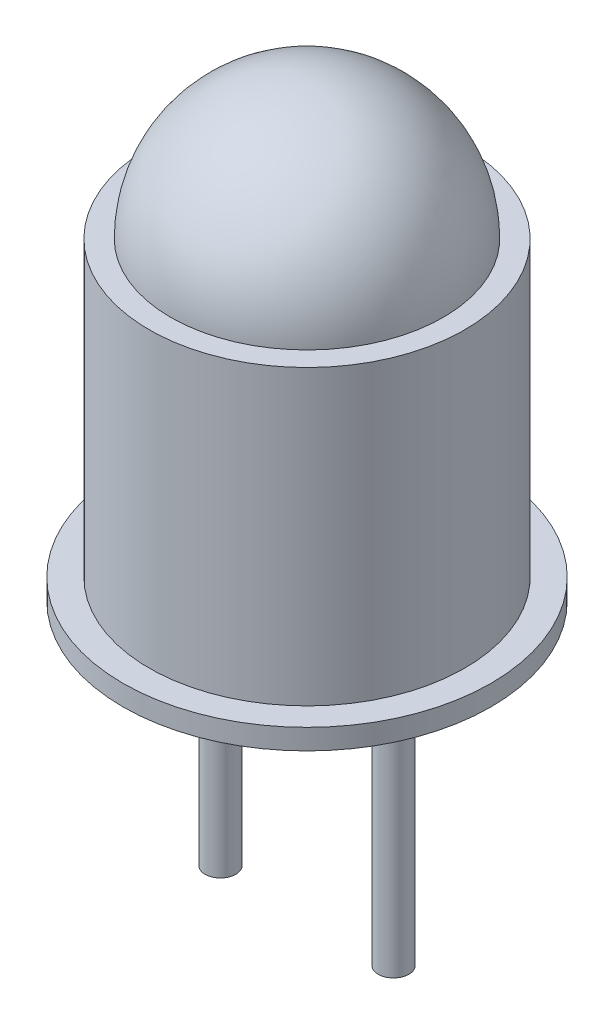
ISO-10303-21;
HEADER;
FILE_DESCRIPTION(('STEP AP214'),'2;1');
FILE_NAME('part.step','',(''),(''),'','','');
FILE_SCHEMA(('AUTOMOTIVE_DESIGN { 1 0 10303 214 1 1 1 1 }'));
ENDSEC;
DATA;
#1=APPLICATION_CONTEXT('core data for automotive mechanical design processes');
#2=APPLICATION_PROTOCOL_DEFINITION('international standard','automotive_design',2000,#1);
#3=PRODUCT_CONTEXT('',#1,'mechanical');
#4=PRODUCT('Part','Part','',(#3));
#5=PRODUCT_RELATED_PRODUCT_CATEGORY('part','',(#4));
#6=PRODUCT_DEFINITION_FORMATION('','',#4);
#7=PRODUCT_DEFINITION_CONTEXT('part definition',#1,'design');
#8=PRODUCT_DEFINITION('design','',#6,#7);
#9=PRODUCT_DEFINITION_SHAPE('','',#8);
#10=(LENGTH_UNIT() NAMED_UNIT(*) SI_UNIT(.MILLI.,.METRE.));
#11=(NAMED_UNIT(*) PLANE_ANGLE_UNIT() SI_UNIT($,.RADIAN.));
#12=(NAMED_UNIT(*) SI_UNIT($,.STERADIAN.) SOLID_ANGLE_UNIT());
#13=UNCERTAINTY_MEASURE_WITH_UNIT(LENGTH_MEASURE(1.E-05),#10,'distance_accuracy_value','');
#14=(GEOMETRIC_REPRESENTATION_CONTEXT(3) GLOBAL_UNCERTAINTY_ASSIGNED_CONTEXT((#13)) GLOBAL_UNIT_ASSIGNED_CONTEXT((#10,
#11,#12)) REPRESENTATION_CONTEXT('',''));
#15=CARTESIAN_POINT('',(0.,0.,0.));
#16=DIRECTION('',(0.,0.,1.));
#17=DIRECTION('',(1.,0.,0.));
#18=AXIS2_PLACEMENT_3D('',#15,#16,#17);
#19=CARTESIAN_POINT('',(0.,4.3,0.));
#20=DIRECTION('',(0.,-1.,0.));
#21=DIRECTION('',(0.,0.,-1.));
#22=AXIS2_PLACEMENT_3D('',#19,#20,#21);
#23=CYLINDRICAL_SURFACE('',#22,2.315);
#24=CARTESIAN_POINT('',(0.,4.3,0.));
#25=DIRECTION('',(0.,1.,0.));
#26=DIRECTION('',(0.,0.,1.));
#27=AXIS2_PLACEMENT_3D('',#24,#25,#26);
#28=CIRCLE('',#27,2.315);
#29=CARTESIAN_POINT('',(0.,4.3,-2.315));
#30=VERTEX_POINT('',#29);
#31=EDGE_CURVE('E41',#30,#30,#28,.T.);
#32=CARTESIAN_POINT('',(0.,0.,0.));
#33=DIRECTION('',(0.,1.,0.));
#34=DIRECTION('',(0.,0.,1.));
#35=AXIS2_PLACEMENT_3D('',#32,#33,#34);
#36=CIRCLE('',#35,2.315);
#37=CARTESIAN_POINT('',(0.,0.,-2.315));
#38=VERTEX_POINT('',#37);
#39=EDGE_CURVE('E45',#38,#38,#36,.T.);
#40=CARTESIAN_POINT('',(0.,4.3,-2.315));
#41=CARTESIAN_POINT('',(0.,4.25520833333333,-2.315));
#42=CARTESIAN_POINT('',(0.,4.21041666666667,-2.315));
#43=CARTESIAN_POINT('',(0.,4.12083333333333,-2.315));
#44=CARTESIAN_POINT('',(0.,4.07604166666667,-2.315));
#45=CARTESIAN_POINT('',(0.,3.98645833333333,-2.315));
#46=CARTESIAN_POINT('',(0.,3.94166666666667,-2.315));
#47=CARTESIAN_POINT('',(0.,3.85208333333333,-2.315));
#48=CARTESIAN_POINT('',(0.,3.80729166666667,-2.315));
#49=CARTESIAN_POINT('',(0.,3.71770833333333,-2.315));
#50=CARTESIAN_POINT('',(0.,3.67291666666667,-2.315));
#51=CARTESIAN_POINT('',(0.,3.58333333333333,-2.315));
#52=CARTESIAN_POINT('',(0.,3.53854166666667,-2.315));
#53=CARTESIAN_POINT('',(0.,3.44895833333333,-2.315));
#54=CARTESIAN_POINT('',(0.,3.40416666666667,-2.315));
#55=CARTESIAN_POINT('',(0.,3.31458333333333,-2.315));
#56=CARTESIAN_POINT('',(0.,3.26979166666667,-2.315));
#57=CARTESIAN_POINT('',(0.,3.18020833333333,-2.315));
#58=CARTESIAN_POINT('',(0.,3.13541666666667,-2.315));
#59=CARTESIAN_POINT('',(0.,3.04583333333333,-2.315));
#60=CARTESIAN_POINT('',(0.,3.00104166666667,-2.315));
#61=CARTESIAN_POINT('',(0.,2.91145833333333,-2.315));
#62=CARTESIAN_POINT('',(0.,2.86666666666667,-2.315));
#63=CARTESIAN_POINT('',(0.,2.77708333333333,-2.315));
#64=CARTESIAN_POINT('',(0.,2.73229166666667,-2.315));
#65=CARTESIAN_POINT('',(0.,2.64270833333333,-2.315));
#66=CARTESIAN_POINT('',(0.,2.59791666666667,-2.315));
#67=CARTESIAN_POINT('',(0.,2.50833333333333,-2.315));
#68=CARTESIAN_POINT('',(0.,2.46354166666667,-2.315));
#69=CARTESIAN_POINT('',(0.,2.37395833333333,-2.315));
#70=CARTESIAN_POINT('',(0.,2.32916666666667,-2.315));
#71=CARTESIAN_POINT('',(0.,2.23958333333333,-2.315));
#72=CARTESIAN_POINT('',(0.,2.19479166666667,-2.315));
#73=CARTESIAN_POINT('',(0.,2.10520833333333,-2.315));
#74=CARTESIAN_POINT('',(0.,2.06041666666667,-2.315));
#75=CARTESIAN_POINT('',(0.,1.97083333333333,-2.315));
#76=CARTESIAN_POINT('',(0.,1.92604166666667,-2.315));
#77=CARTESIAN_POINT('',(0.,1.83645833333333,-2.315));
#78=CARTESIAN_POINT('',(0.,1.79166666666667,-2.315));
#79=CARTESIAN_POINT('',(0.,1.70208333333333,-2.315));
#80=CARTESIAN_POINT('',(0.,1.65729166666667,-2.315));
#81=CARTESIAN_POINT('',(0.,1.56770833333333,-2.315));
#82=CARTESIAN_POINT('',(0.,1.52291666666667,-2.315));
#83=CARTESIAN_POINT('',(0.,1.43333333333333,-2.315));
#84=CARTESIAN_POINT('',(0.,1.38854166666667,-2.315));
#85=CARTESIAN_POINT('',(0.,1.29895833333333,-2.315));
#86=CARTESIAN_POINT('',(0.,1.25416666666667,-2.315));
#87=CARTESIAN_POINT('',(0.,1.16458333333333,-2.315));
#88=CARTESIAN_POINT('',(0.,1.11979166666667,-2.315));
#89=CARTESIAN_POINT('',(0.,1.03020833333333,-2.315));
#90=CARTESIAN_POINT('',(0.,0.985416666666665,-2.315));
#91=CARTESIAN_POINT('',(0.,0.895833333333332,-2.315));
#92=CARTESIAN_POINT('',(0.,0.851041666666665,-2.315));
#93=CARTESIAN_POINT('',(0.,0.761458333333332,-2.315));
#94=CARTESIAN_POINT('',(0.,0.716666666666665,-2.315));
#95=CARTESIAN_POINT('',(0.,0.627083333333332,-2.315));
#96=CARTESIAN_POINT('',(0.,0.582291666666665,-2.315));
#97=CARTESIAN_POINT('',(0.,0.492708333333332,-2.315));
#98=CARTESIAN_POINT('',(0.,0.447916666666665,-2.315));
#99=CARTESIAN_POINT('',(0.,0.358333333333332,-2.315));
#100=CARTESIAN_POINT('',(0.,0.313541666666666,-2.315));
#101=CARTESIAN_POINT('',(0.,0.223958333333332,-2.315));
#102=CARTESIAN_POINT('',(0.,0.179166666666666,-2.315));
#103=CARTESIAN_POINT('',(0.,0.0895833333333324,-2.315));
#104=CARTESIAN_POINT('',(0.,0.0447916666666658,-2.315));
#105=CARTESIAN_POINT('',(0.,0.,-2.315));
#106=B_SPLINE_CURVE_WITH_KNOTS('',3,(#40,#41,#42,#43,#44,#45,#46,#47,#48,#49,#50,#51,#52,#53,
#54,#55,#56,#57,#58,#59,#60,#61,#62,#63,#64,#65,#66,#67,#68,#69,#70,#71,#72,#73,#74,#75,#76,#77,
#78,#79,#80,#81,#82,#83,#84,#85,#86,#87,#88,#89,#90,#91,#92,#93,#94,#95,#96,#97,#98,#99,#100,
#101,#102,#103,#104,#105),.UNSPECIFIED.,.F.,.F.,(4,2,2,2,2,2,2,2,2,2,2,2,2,2,2,2,2,2,2,2,2,2,2,
2,2,2,2,2,2,2,2,2,4),(0.,0.134375000000001,0.268750000000001,0.403125000000001,
0.537500000000001,0.671875000000001,0.806250000000001,0.940625,1.075,1.209375,1.34375,1.478125,
1.6125,1.746875,1.88125,2.015625,2.15,2.284375,2.41875,2.553125,2.6875,2.821875,2.95625,
3.090625,3.225,3.359375,3.49375,3.628125,3.7625,3.896875,4.03125,4.165625,4.3),.UNSPECIFIED.);
#107=EDGE_CURVE('BSEAM35',#30,#38,#106,.T.);
#108=ORIENTED_EDGE('',*,*,#31,.F.);
#109=ORIENTED_EDGE('',*,*,#39,.T.);
#110=ORIENTED_EDGE('',*,*,#107,.T.);
#111=ORIENTED_EDGE('',*,*,#107,.F.);
#112=EDGE_LOOP('',(#108,#110,#109,#111));
#113=FACE_BOUND('',#112,.T.);
#114=ADVANCED_FACE('F35',(#113),#23,.T.);
#115=CARTESIAN_POINT('',(0.,4.3,0.));
#116=DIRECTION('',(0.,1.,0.));
#117=DIRECTION('',(0.,0.,1.));
#118=AXIS2_PLACEMENT_3D('',#115,#116,#117);
#119=PLANE('',#118);
#120=CARTESIAN_POINT('',(0.,4.3,0.));
#121=DIRECTION('',(0.,1.,0.));
#122=DIRECTION('',(0.,0.,1.));
#123=AXIS2_PLACEMENT_3D('',#120,#121,#122);
#124=CIRCLE('',#123,2.);
#125=CARTESIAN_POINT('',(0.,4.3,2.));
#126=VERTEX_POINT('',#125);
#127=EDGE_CURVE('E10',#126,#126,#124,.T.);
#128=ORIENTED_EDGE('',*,*,#127,.F.);
#129=EDGE_LOOP('',(#128));
#130=FACE_BOUND('',#129,.T.);
#131=ORIENTED_EDGE('',*,*,#31,.T.);
#132=EDGE_LOOP('',(#131));
#133=FACE_BOUND('',#132,.T.);
#134=ADVANCED_FACE('F108',(#130,#133),#119,.T.);
#135=CARTESIAN_POINT('',(0.,4.3,0.));
#136=DIRECTION('',(0.,1.,0.));
#137=DIRECTION('',(-1.,0.,0.));
#138=AXIS2_PLACEMENT_3D('',#135,#136,#137);
#139=SPHERICAL_SURFACE('',#138,2.);
#140=ORIENTED_EDGE('',*,*,#127,.T.);
#141=EDGE_LOOP('',(#140));
#142=FACE_BOUND('',#141,.T.);
#143=ADVANCED_FACE('F92',(#142),#139,.T.);
#144=CARTESIAN_POINT('',(0.,-0.3,0.));
#145=DIRECTION('',(0.,1.,0.));
#146=DIRECTION('',(0.,0.,1.));
#147=AXIS2_PLACEMENT_3D('',#144,#145,#146);
#148=CYLINDRICAL_SURFACE('',#147,2.7);
#149=CARTESIAN_POINT('',(0.,-0.3,0.));
#150=DIRECTION('',(0.,-1.,0.));
#151=DIRECTION('',(0.,0.,-1.));
#152=AXIS2_PLACEMENT_3D('',#149,#150,#151);
#153=CIRCLE('',#152,2.7);
#154=CARTESIAN_POINT('',(0.,-0.3,-2.7));
#155=VERTEX_POINT('',#154);
#156=EDGE_CURVE('E50',#155,#155,#153,.T.);
#157=ORIENTED_EDGE('',*,*,#156,.F.);
#158=EDGE_LOOP('',(#157));
#159=FACE_BOUND('',#158,.T.);
#160=CARTESIAN_POINT('',(0.,0.,0.));
#161=DIRECTION('',(0.,-1.,0.));
#162=DIRECTION('',(0.,0.,-1.));
#163=AXIS2_PLACEMENT_3D('',#160,#161,#162);
#164=CIRCLE('',#163,2.7);
#165=CARTESIAN_POINT('',(0.,0.,-2.7));
#166=VERTEX_POINT('',#165);
#167=EDGE_CURVE('E52',#166,#166,#164,.T.);
#168=ORIENTED_EDGE('',*,*,#167,.T.);
#169=EDGE_LOOP('',(#168));
#170=FACE_BOUND('',#169,.T.);
#171=ADVANCED_FACE('F82',(#159,#170),#148,.T.);
#172=CARTESIAN_POINT('',(0.,-0.3,0.));
#173=DIRECTION('',(0.,-1.,0.));
#174=DIRECTION('',(0.,0.,-1.));
#175=AXIS2_PLACEMENT_3D('',#172,#173,#174);
#176=PLANE('',#175);
#177=CARTESIAN_POINT('',(0.,-0.3,-1.27));
#178=DIRECTION('',(0.,-1.,0.));
#179=DIRECTION('',(0.,0.,-1.));
#180=AXIS2_PLACEMENT_3D('',#177,#178,#179);
#181=CIRCLE('',#180,0.225);
#182=CARTESIAN_POINT('',(0.,-0.3,-1.495));
#183=VERTEX_POINT('',#182);
#184=EDGE_CURVE('E67',#183,#183,#181,.T.);
#185=ORIENTED_EDGE('',*,*,#184,.F.);
#186=EDGE_LOOP('',(#185));
#187=FACE_BOUND('',#186,.T.);
#188=CARTESIAN_POINT('',(1.27,-0.3,0.));
#189=DIRECTION('',(0.,-1.,0.));
#190=DIRECTION('',(0.,0.,-1.));
#191=AXIS2_PLACEMENT_3D('',#188,#189,#190);
#192=CIRCLE('',#191,0.225);
#193=CARTESIAN_POINT('',(1.27,-0.3,-0.225));
#194=VERTEX_POINT('',#193);
#195=EDGE_CURVE('E61',#194,#194,#192,.T.);
#196=ORIENTED_EDGE('',*,*,#195,.F.);
#197=EDGE_LOOP('',(#196));
#198=FACE_BOUND('',#197,.T.);
#199=CARTESIAN_POINT('',(-1.27,-0.3,0.));
#200=DIRECTION('',(0.,-1.,0.));
#201=DIRECTION('',(0.,0.,-1.));
#202=AXIS2_PLACEMENT_3D('',#199,#200,#201);
#203=CIRCLE('',#202,0.225);
#204=CARTESIAN_POINT('',(-1.27,-0.3,-0.225));
#205=VERTEX_POINT('',#204);
#206=EDGE_CURVE('E58',#205,#205,#203,.T.);
#207=ORIENTED_EDGE('',*,*,#206,.F.);
#208=EDGE_LOOP('',(#207));
#209=FACE_BOUND('',#208,.T.);
#210=ORIENTED_EDGE('',*,*,#156,.T.);
#211=EDGE_LOOP('',(#210));
#212=FACE_BOUND('',#211,.T.);
#213=ADVANCED_FACE('F78',(#187,#198,#209,#212),#176,.T.);
#214=CARTESIAN_POINT('',(0.,0.,0.));
#215=DIRECTION('',(0.,-1.,0.));
#216=DIRECTION('',(0.,0.,-1.));
#217=AXIS2_PLACEMENT_3D('',#214,#215,#216);
#218=PLANE('',#217);
#219=ORIENTED_EDGE('',*,*,#39,.F.);
#220=EDGE_LOOP('',(#219));
#221=FACE_BOUND('',#220,.T.);
#222=ORIENTED_EDGE('',*,*,#167,.F.);
#223=EDGE_LOOP('',(#222));
#224=FACE_BOUND('',#223,.T.);
#225=ADVANCED_FACE('F81',(#221,#224),#218,.F.);
#226=CARTESIAN_POINT('',(-1.27,-4.3,0.));
#227=DIRECTION('',(0.,1.,0.));
#228=DIRECTION('',(0.,0.,1.));
#229=AXIS2_PLACEMENT_3D('',#226,#227,#228);
#230=CYLINDRICAL_SURFACE('',#229,0.225);
#231=CARTESIAN_POINT('',(-1.27,-4.3,0.));
#232=DIRECTION('',(0.,-1.,0.));
#233=DIRECTION('',(0.,0.,-1.));
#234=AXIS2_PLACEMENT_3D('',#231,#232,#233);
#235=CIRCLE('',#234,0.225);
#236=CARTESIAN_POINT('',(-1.27,-4.3,-0.225));
#237=VERTEX_POINT('',#236);
#238=EDGE_CURVE('E55',#237,#237,#235,.T.);
#239=ORIENTED_EDGE('',*,*,#238,.F.);
#240=EDGE_LOOP('',(#239));
#241=FACE_BOUND('',#240,.T.);
#242=ORIENTED_EDGE('',*,*,#206,.T.);
#243=EDGE_LOOP('',(#242));
#244=FACE_BOUND('',#243,.T.);
#245=ADVANCED_FACE('F97',(#241,#244),#230,.T.);
#246=CARTESIAN_POINT('',(-1.27,-4.3,0.));
#247=DIRECTION('',(0.,-1.,0.));
#248=DIRECTION('',(0.,0.,-1.));
#249=AXIS2_PLACEMENT_3D('',#246,#247,#248);
#250=PLANE('',#249);
#251=ORIENTED_EDGE('',*,*,#238,.T.);
#252=EDGE_LOOP('',(#251));
#253=FACE_BOUND('',#252,.T.);
#254=ADVANCED_FACE('F103',(#253),#250,.T.);
#255=CARTESIAN_POINT('',(1.27,-4.3,0.));
#256=DIRECTION('',(0.,1.,0.));
#257=DIRECTION('',(0.,0.,1.));
#258=AXIS2_PLACEMENT_3D('',#255,#256,#257);
#259=CYLINDRICAL_SURFACE('',#258,0.225);
#260=CARTESIAN_POINT('',(1.27,-4.3,0.));
#261=DIRECTION('',(0.,-1.,0.));
#262=DIRECTION('',(0.,0.,-1.));
#263=AXIS2_PLACEMENT_3D('',#260,#261,#262);
#264=CIRCLE('',#263,0.225);
#265=CARTESIAN_POINT('',(1.27,-4.3,-0.225));
#266=VERTEX_POINT('',#265);
#267=EDGE_CURVE('E64',#266,#266,#264,.T.);
#268=ORIENTED_EDGE('',*,*,#267,.F.);
#269=EDGE_LOOP('',(#268));
#270=FACE_BOUND('',#269,.T.);
#271=ORIENTED_EDGE('',*,*,#195,.T.);
#272=EDGE_LOOP('',(#271));
#273=FACE_BOUND('',#272,.T.);
#274=ADVANCED_FACE('F148',(#270,#273),#259,.T.);
#275=CARTESIAN_POINT('',(1.27,-4.3,0.));
#276=DIRECTION('',(0.,-1.,0.));
#277=DIRECTION('',(0.,0.,-1.));
#278=AXIS2_PLACEMENT_3D('',#275,#276,#277);
#279=PLANE('',#278);
#280=ORIENTED_EDGE('',*,*,#267,.T.);
#281=EDGE_LOOP('',(#280));
#282=FACE_BOUND('',#281,.T.);
#283=ADVANCED_FACE('F159',(#282),#279,.T.);
#284=CARTESIAN_POINT('',(0.,-4.3,-1.27));
#285=DIRECTION('',(0.,1.,0.));
#286=DIRECTION('',(0.,0.,1.));
#287=AXIS2_PLACEMENT_3D('',#284,#285,#286);
#288=CYLINDRICAL_SURFACE('',#287,0.225);
#289=CARTESIAN_POINT('',(0.,-4.3,-1.27));
#290=DIRECTION('',(0.,-1.,0.));
#291=DIRECTION('',(0.,0.,-1.));
#292=AXIS2_PLACEMENT_3D('',#289,#290,#291);
#293=CIRCLE('',#292,0.225);
#294=CARTESIAN_POINT('',(0.,-4.3,-1.495));
#295=VERTEX_POINT('',#294);
#296=EDGE_CURVE('E70',#295,#295,#293,.T.);
#297=ORIENTED_EDGE('',*,*,#296,.F.);
#298=EDGE_LOOP('',(#297));
#299=FACE_BOUND('',#298,.T.);
#300=ORIENTED_EDGE('',*,*,#184,.T.);
#301=EDGE_LOOP('',(#300));
#302=FACE_BOUND('',#301,.T.);
#303=ADVANCED_FACE('F76',(#299,#302),#288,.T.);
#304=CARTESIAN_POINT('',(0.,-4.3,-1.27));
#305=DIRECTION('',(0.,-1.,0.));
#306=DIRECTION('',(0.,0.,-1.));
#307=AXIS2_PLACEMENT_3D('',#304,#305,#306);
#308=PLANE('',#307);
#309=ORIENTED_EDGE('',*,*,#296,.T.);
#310=EDGE_LOOP('',(#309));
#311=FACE_BOUND('',#310,.T.);
#312=ADVANCED_FACE('F180',(#311),#308,.T.);
#313=CLOSED_SHELL('',(#114,#134,#143,#171,#213,#225,#245,#254,#274,#283,#303,#312));
#314=MANIFOLD_SOLID_BREP('B2',#313);
#315=ADVANCED_BREP_SHAPE_REPRESENTATION('',(#18,#314),#14);
#316=SHAPE_DEFINITION_REPRESENTATION(#9,#315);
ENDSEC;
END-ISO-10303-21;
